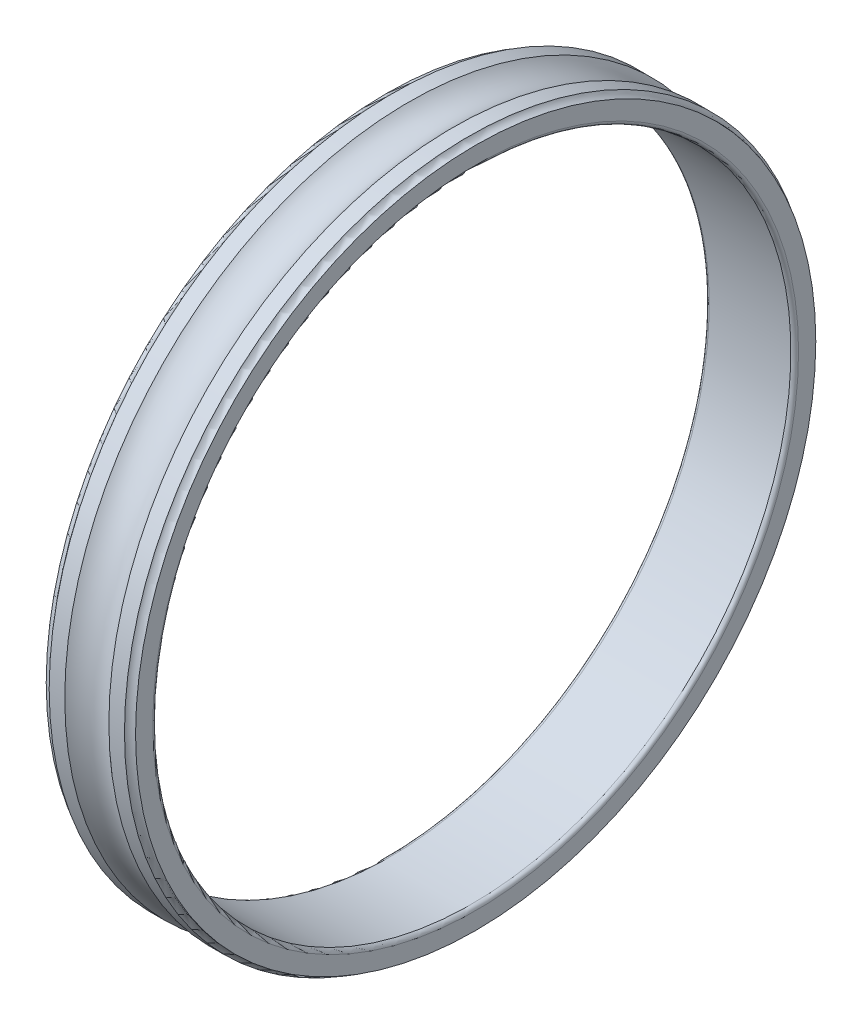
ISO-10303-21;
HEADER;
FILE_DESCRIPTION(('STEP AP214'),'2;1');
FILE_NAME('part.step','',(''),(''),'','','');
FILE_SCHEMA(('AUTOMOTIVE_DESIGN { 1 0 10303 214 1 1 1 1 }'));
ENDSEC;
DATA;
#1=APPLICATION_CONTEXT('core data for automotive mechanical design processes');
#2=APPLICATION_PROTOCOL_DEFINITION('international standard','automotive_design',2000,#1);
#3=PRODUCT_CONTEXT('',#1,'mechanical');
#4=PRODUCT('Part','Part','',(#3));
#5=PRODUCT_RELATED_PRODUCT_CATEGORY('part','',(#4));
#6=PRODUCT_DEFINITION_FORMATION('','',#4);
#7=PRODUCT_DEFINITION_CONTEXT('part definition',#1,'design');
#8=PRODUCT_DEFINITION('design','',#6,#7);
#9=PRODUCT_DEFINITION_SHAPE('','',#8);
#10=(LENGTH_UNIT() NAMED_UNIT(*) SI_UNIT(.MILLI.,.METRE.));
#11=(NAMED_UNIT(*) PLANE_ANGLE_UNIT() SI_UNIT($,.RADIAN.));
#12=(NAMED_UNIT(*) SI_UNIT($,.STERADIAN.) SOLID_ANGLE_UNIT());
#13=UNCERTAINTY_MEASURE_WITH_UNIT(LENGTH_MEASURE(1.E-05),#10,'distance_accuracy_value','');
#14=(GEOMETRIC_REPRESENTATION_CONTEXT(3) GLOBAL_UNCERTAINTY_ASSIGNED_CONTEXT((#13)) GLOBAL_UNIT_ASSIGNED_CONTEXT((#10,
#11,#12)) REPRESENTATION_CONTEXT('',''));
#15=CARTESIAN_POINT('',(0.,0.,0.));
#16=DIRECTION('',(0.,0.,1.));
#17=DIRECTION('',(1.,0.,0.));
#18=AXIS2_PLACEMENT_3D('',#15,#16,#17);
#19=CARTESIAN_POINT('',(0.3,0.,0.));
#20=DIRECTION('',(-1.,0.,0.));
#21=DIRECTION('',(0.,0.,1.));
#22=AXIS2_PLACEMENT_3D('',#19,#20,#21);
#23=TOROIDAL_SURFACE('',#22,25.3,0.3);
#24=CARTESIAN_POINT('',(0.3,0.,0.));
#25=DIRECTION('',(-1.,0.,0.));
#26=DIRECTION('',(0.,0.,1.));
#27=AXIS2_PLACEMENT_3D('',#24,#25,#26);
#28=CIRCLE('',#27,25.);
#29=CARTESIAN_POINT('',(0.3,0.,25.));
#30=VERTEX_POINT('',#29);
#31=EDGE_CURVE('E10',#30,#30,#28,.T.);
#32=ORIENTED_EDGE('',*,*,#31,.F.);
#33=EDGE_LOOP('',(#32));
#34=FACE_BOUND('',#33,.T.);
#35=CARTESIAN_POINT('',(0.,0.,0.));
#36=DIRECTION('',(-1.,0.,0.));
#37=DIRECTION('',(0.,0.,1.));
#38=AXIS2_PLACEMENT_3D('',#35,#36,#37);
#39=CIRCLE('',#38,25.3);
#40=CARTESIAN_POINT('',(0.,0.,25.3));
#41=VERTEX_POINT('',#40);
#42=EDGE_CURVE('E64',#41,#41,#39,.T.);
#43=ORIENTED_EDGE('',*,*,#42,.T.);
#44=EDGE_LOOP('',(#43));
#45=FACE_BOUND('',#44,.T.);
#46=ADVANCED_FACE('F14',(#34,#45),#23,.T.);
#47=CARTESIAN_POINT('',(3.5,0.,0.));
#48=DIRECTION('',(-1.,0.,0.));
#49=DIRECTION('',(0.,0.,1.));
#50=AXIS2_PLACEMENT_3D('',#47,#48,#49);
#51=CYLINDRICAL_SURFACE('',#50,25.);
#52=CARTESIAN_POINT('',(6.7,0.,0.));
#53=DIRECTION('',(-1.,0.,0.));
#54=DIRECTION('',(0.,0.,1.));
#55=AXIS2_PLACEMENT_3D('',#52,#53,#54);
#56=CIRCLE('',#55,25.);
#57=CARTESIAN_POINT('',(6.7,0.,25.));
#58=VERTEX_POINT('',#57);
#59=EDGE_CURVE('E21',#58,#58,#56,.T.);
#60=ORIENTED_EDGE('',*,*,#59,.F.);
#61=EDGE_LOOP('',(#60));
#62=FACE_BOUND('',#61,.T.);
#63=ORIENTED_EDGE('',*,*,#31,.T.);
#64=EDGE_LOOP('',(#63));
#65=FACE_BOUND('',#64,.T.);
#66=ADVANCED_FACE('F89',(#62,#65),#51,.F.);
#67=CARTESIAN_POINT('',(6.7,0.,0.));
#68=DIRECTION('',(-1.,0.,0.));
#69=DIRECTION('',(0.,0.,1.));
#70=AXIS2_PLACEMENT_3D('',#67,#68,#69);
#71=TOROIDAL_SURFACE('',#70,25.3,0.3);
#72=CARTESIAN_POINT('',(7.,0.,0.));
#73=DIRECTION('',(-1.,0.,0.));
#74=DIRECTION('',(0.,0.,1.));
#75=AXIS2_PLACEMENT_3D('',#72,#73,#74);
#76=CIRCLE('',#75,25.3);
#77=CARTESIAN_POINT('',(7.,0.,25.3));
#78=VERTEX_POINT('',#77);
#79=EDGE_CURVE('E30',#78,#78,#76,.T.);
#80=ORIENTED_EDGE('',*,*,#79,.F.);
#81=EDGE_LOOP('',(#80));
#82=FACE_BOUND('',#81,.T.);
#83=ORIENTED_EDGE('',*,*,#59,.T.);
#84=EDGE_LOOP('',(#83));
#85=FACE_BOUND('',#84,.T.);
#86=ADVANCED_FACE('F94',(#82,#85),#71,.T.);
#87=CARTESIAN_POINT('',(7.,25.3,0.));
#88=DIRECTION('',(-1.,0.,0.));
#89=DIRECTION('',(0.,0.,1.));
#90=AXIS2_PLACEMENT_3D('',#87,#88,#89);
#91=PLANE('',#90);
#92=CARTESIAN_POINT('',(7.,0.,0.));
#93=DIRECTION('',(-1.,0.,0.));
#94=DIRECTION('',(0.,0.,1.));
#95=AXIS2_PLACEMENT_3D('',#92,#93,#94);
#96=CIRCLE('',#95,26.65);
#97=CARTESIAN_POINT('',(7.,0.,26.65));
#98=VERTEX_POINT('',#97);
#99=EDGE_CURVE('E38',#98,#98,#96,.T.);
#100=ORIENTED_EDGE('',*,*,#99,.F.);
#101=EDGE_LOOP('',(#100));
#102=FACE_BOUND('',#101,.T.);
#103=ORIENTED_EDGE('',*,*,#79,.T.);
#104=EDGE_LOOP('',(#103));
#105=FACE_BOUND('',#104,.T.);
#106=ADVANCED_FACE('F99',(#102,#105),#91,.F.);
#107=CARTESIAN_POINT('',(7.,0.,0.));
#108=DIRECTION('',(-1.,0.,0.));
#109=DIRECTION('',(0.,0.,1.));
#110=AXIS2_PLACEMENT_3D('',#107,#108,#109);
#111=TOROIDAL_SURFACE('',#110,27.2863636363636,0.636363636363636);
#112=ORIENTED_EDGE('',*,*,#99,.T.);
#113=EDGE_LOOP('',(#112));
#114=FACE_BOUND('',#113,.T.);
#115=CARTESIAN_POINT('',(6.44889292486445,0.,0.));
#116=DIRECTION('',(-1.,0.,0.));
#117=DIRECTION('',(0.,0.,1.));
#118=AXIS2_PLACEMENT_3D('',#115,#116,#117);
#119=CIRCLE('',#118,26.9681818181818);
#120=CARTESIAN_POINT('',(6.44889292486445,0.,26.9681818181818));
#121=VERTEX_POINT('',#120);
#122=EDGE_CURVE('E44',#121,#121,#119,.T.);
#123=ORIENTED_EDGE('',*,*,#122,.F.);
#124=EDGE_LOOP('',(#123));
#125=FACE_BOUND('',#124,.T.);
#126=ADVANCED_FACE('F105',(#114,#125),#111,.F.);
#127=CARTESIAN_POINT('',(3.5,0.,0.));
#128=DIRECTION('',(-1.,0.,0.));
#129=DIRECTION('',(0.,0.,1.));
#130=AXIS2_PLACEMENT_3D('',#127,#128,#129);
#131=CYLINDRICAL_SURFACE('',#130,26.9681818181818);
#132=CARTESIAN_POINT('',(5.22783334203598,0.,0.));
#133=DIRECTION('',(-1.,0.,0.));
#134=DIRECTION('',(0.,0.,1.));
#135=AXIS2_PLACEMENT_3D('',#132,#133,#134);
#136=CIRCLE('',#135,26.9681818181818);
#137=CARTESIAN_POINT('',(5.22783334203598,0.,26.9681818181818));
#138=VERTEX_POINT('',#137);
#139=EDGE_CURVE('E48',#138,#138,#136,.T.);
#140=ORIENTED_EDGE('',*,*,#139,.F.);
#141=EDGE_LOOP('',(#140));
#142=FACE_BOUND('',#141,.T.);
#143=ORIENTED_EDGE('',*,*,#122,.T.);
#144=EDGE_LOOP('',(#143));
#145=FACE_BOUND('',#144,.T.);
#146=ADVANCED_FACE('F109',(#142,#145),#131,.T.);
#147=CARTESIAN_POINT('',(3.5,0.,0.));
#148=DIRECTION('',(-1.,0.,0.));
#149=DIRECTION('',(0.,0.,1.));
#150=AXIS2_PLACEMENT_3D('',#147,#148,#149);
#151=TOROIDAL_SURFACE('',#150,28.775,2.5);
#152=ORIENTED_EDGE('',*,*,#139,.T.);
#153=EDGE_LOOP('',(#152));
#154=FACE_BOUND('',#153,.T.);
#155=CARTESIAN_POINT('',(1.77216665796401,0.,0.));
#156=DIRECTION('',(-1.,0.,0.));
#157=DIRECTION('',(0.,0.,1.));
#158=AXIS2_PLACEMENT_3D('',#155,#156,#157);
#159=CIRCLE('',#158,26.9681818181818);
#160=CARTESIAN_POINT('',(1.77216665796401,0.,26.9681818181818));
#161=VERTEX_POINT('',#160);
#162=EDGE_CURVE('E52',#161,#161,#159,.T.);
#163=ORIENTED_EDGE('',*,*,#162,.F.);
#164=EDGE_LOOP('',(#163));
#165=FACE_BOUND('',#164,.T.);
#166=ADVANCED_FACE('F85',(#154,#165),#151,.F.);
#167=CARTESIAN_POINT('',(3.5,0.,0.));
#168=DIRECTION('',(-1.,0.,0.));
#169=DIRECTION('',(0.,0.,1.));
#170=AXIS2_PLACEMENT_3D('',#167,#168,#169);
#171=CYLINDRICAL_SURFACE('',#170,26.9681818181818);
#172=CARTESIAN_POINT('',(0.551107075135551,0.,0.));
#173=DIRECTION('',(-1.,0.,0.));
#174=DIRECTION('',(0.,0.,1.));
#175=AXIS2_PLACEMENT_3D('',#172,#173,#174);
#176=CIRCLE('',#175,26.9681818181818);
#177=CARTESIAN_POINT('',(0.551107075135551,0.,26.9681818181818));
#178=VERTEX_POINT('',#177);
#179=EDGE_CURVE('E56',#178,#178,#176,.T.);
#180=ORIENTED_EDGE('',*,*,#179,.F.);
#181=EDGE_LOOP('',(#180));
#182=FACE_BOUND('',#181,.T.);
#183=ORIENTED_EDGE('',*,*,#162,.T.);
#184=EDGE_LOOP('',(#183));
#185=FACE_BOUND('',#184,.T.);
#186=ADVANCED_FACE('F78',(#182,#185),#171,.T.);
#187=CARTESIAN_POINT('',(0.,0.,0.));
#188=DIRECTION('',(-1.,0.,0.));
#189=DIRECTION('',(0.,0.,1.));
#190=AXIS2_PLACEMENT_3D('',#187,#188,#189);
#191=TOROIDAL_SURFACE('',#190,27.2863636363636,0.636363636363636);
#192=ORIENTED_EDGE('',*,*,#179,.T.);
#193=EDGE_LOOP('',(#192));
#194=FACE_BOUND('',#193,.T.);
#195=CARTESIAN_POINT('',(0.,0.,0.));
#196=DIRECTION('',(-1.,0.,0.));
#197=DIRECTION('',(0.,0.,1.));
#198=AXIS2_PLACEMENT_3D('',#195,#196,#197);
#199=CIRCLE('',#198,26.65);
#200=CARTESIAN_POINT('',(0.,0.,26.65));
#201=VERTEX_POINT('',#200);
#202=EDGE_CURVE('E60',#201,#201,#199,.T.);
#203=ORIENTED_EDGE('',*,*,#202,.F.);
#204=EDGE_LOOP('',(#203));
#205=FACE_BOUND('',#204,.T.);
#206=ADVANCED_FACE('F73',(#194,#205),#191,.F.);
#207=CARTESIAN_POINT('',(0.,26.65,0.));
#208=DIRECTION('',(1.,0.,0.));
#209=DIRECTION('',(0.,0.,-1.));
#210=AXIS2_PLACEMENT_3D('',#207,#208,#209);
#211=PLANE('',#210);
#212=ORIENTED_EDGE('',*,*,#42,.F.);
#213=EDGE_LOOP('',(#212));
#214=FACE_BOUND('',#213,.T.);
#215=ORIENTED_EDGE('',*,*,#202,.T.);
#216=EDGE_LOOP('',(#215));
#217=FACE_BOUND('',#216,.T.);
#218=ADVANCED_FACE('F70',(#214,#217),#211,.F.);
#219=CLOSED_SHELL('',(#46,#66,#86,#106,#126,#146,#166,#186,#206,#218));
#220=MANIFOLD_SOLID_BREP('B1',#219);
#221=ADVANCED_BREP_SHAPE_REPRESENTATION('',(#18,#220),#14);
#222=SHAPE_DEFINITION_REPRESENTATION(#9,#221);
ENDSEC;
END-ISO-10303-21;
